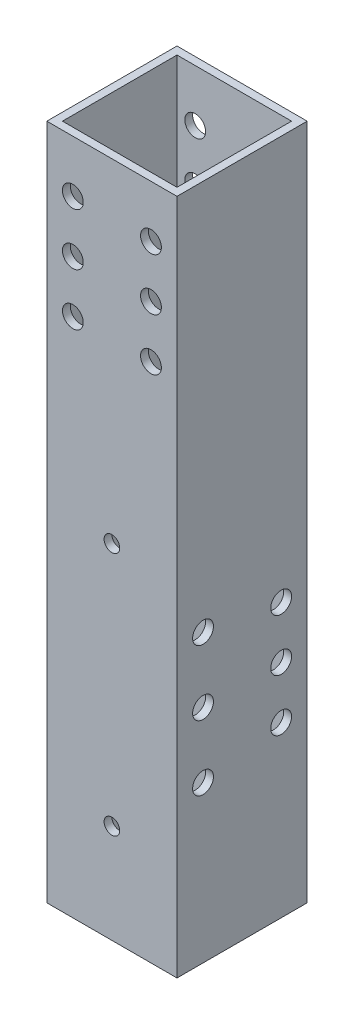
ISO-10303-21;
HEADER;
FILE_DESCRIPTION(('STEP AP214'),'2;1');
FILE_NAME('part.step','',(''),(''),'','','');
FILE_SCHEMA(('AUTOMOTIVE_DESIGN { 1 0 10303 214 1 1 1 1 }'));
ENDSEC;
DATA;
#1=APPLICATION_CONTEXT('core data for automotive mechanical design processes');
#2=APPLICATION_PROTOCOL_DEFINITION('international standard','automotive_design',2000,#1);
#3=PRODUCT_CONTEXT('',#1,'mechanical');
#4=PRODUCT('Part','Part','',(#3));
#5=PRODUCT_RELATED_PRODUCT_CATEGORY('part','',(#4));
#6=PRODUCT_DEFINITION_FORMATION('','',#4);
#7=PRODUCT_DEFINITION_CONTEXT('part definition',#1,'design');
#8=PRODUCT_DEFINITION('design','',#6,#7);
#9=PRODUCT_DEFINITION_SHAPE('','',#8);
#10=(LENGTH_UNIT() NAMED_UNIT(*) SI_UNIT(.MILLI.,.METRE.));
#11=(NAMED_UNIT(*) PLANE_ANGLE_UNIT() SI_UNIT($,.RADIAN.));
#12=(NAMED_UNIT(*) SI_UNIT($,.STERADIAN.) SOLID_ANGLE_UNIT());
#13=UNCERTAINTY_MEASURE_WITH_UNIT(LENGTH_MEASURE(1.E-05),#10,'distance_accuracy_value','');
#14=(GEOMETRIC_REPRESENTATION_CONTEXT(3) GLOBAL_UNCERTAINTY_ASSIGNED_CONTEXT((#13)) GLOBAL_UNIT_ASSIGNED_CONTEXT((#10,
#11,#12)) REPRESENTATION_CONTEXT('',''));
#15=CARTESIAN_POINT('',(0.,0.,0.));
#16=DIRECTION('',(0.,0.,1.));
#17=DIRECTION('',(1.,0.,0.));
#18=AXIS2_PLACEMENT_3D('',#15,#16,#17);
#19=CARTESIAN_POINT('',(12.5,-65.,-12.5));
#20=DIRECTION('',(1.,0.,0.));
#21=DIRECTION('',(0.,0.,-1.));
#22=AXIS2_PLACEMENT_3D('',#19,#20,#21);
#23=PLANE('',#22);
#24=CARTESIAN_POINT('',(12.5,-12.5,-7.5));
#25=DIRECTION('',(1.,0.,0.));
#26=DIRECTION('',(0.,0.,-1.));
#27=AXIS2_PLACEMENT_3D('',#24,#25,#26);
#28=CIRCLE('',#27,1.99999999999999);
#29=CARTESIAN_POINT('',(12.5,-12.5,-9.49999999999999));
#30=VERTEX_POINT('',#29);
#31=EDGE_CURVE('E244',#30,#30,#28,.T.);
#32=ORIENTED_EDGE('',*,*,#31,.F.);
#33=EDGE_LOOP('',(#32));
#34=FACE_BOUND('',#33,.T.);
#35=CARTESIAN_POINT('',(12.5,-22.5,-7.5));
#36=DIRECTION('',(1.,0.,0.));
#37=DIRECTION('',(0.,0.,-1.));
#38=AXIS2_PLACEMENT_3D('',#35,#36,#37);
#39=CIRCLE('',#38,2.);
#40=CARTESIAN_POINT('',(12.5,-22.5,-9.5));
#41=VERTEX_POINT('',#40);
#42=EDGE_CURVE('E250',#41,#41,#39,.T.);
#43=ORIENTED_EDGE('',*,*,#42,.F.);
#44=EDGE_LOOP('',(#43));
#45=FACE_BOUND('',#44,.T.);
#46=CARTESIAN_POINT('',(12.5,-35.,7.5));
#47=DIRECTION('',(1.,0.,0.));
#48=DIRECTION('',(0.,0.,-1.));
#49=AXIS2_PLACEMENT_3D('',#46,#47,#48);
#50=CIRCLE('',#49,2.);
#51=CARTESIAN_POINT('',(12.5,-35.,5.49999999999999));
#52=VERTEX_POINT('',#51);
#53=EDGE_CURVE('E256',#52,#52,#50,.T.);
#54=ORIENTED_EDGE('',*,*,#53,.F.);
#55=EDGE_LOOP('',(#54));
#56=FACE_BOUND('',#55,.T.);
#57=CARTESIAN_POINT('',(12.5,-10.,7.5));
#58=DIRECTION('',(1.,0.,0.));
#59=DIRECTION('',(0.,0.,-1.));
#60=AXIS2_PLACEMENT_3D('',#57,#58,#59);
#61=CIRCLE('',#60,2.);
#62=CARTESIAN_POINT('',(12.5,-10.,5.49999999999999));
#63=VERTEX_POINT('',#62);
#64=EDGE_CURVE('E237',#63,#63,#61,.T.);
#65=ORIENTED_EDGE('',*,*,#64,.F.);
#66=EDGE_LOOP('',(#65));
#67=FACE_BOUND('',#66,.T.);
#68=CARTESIAN_POINT('',(12.5,-22.5,7.5));
#69=DIRECTION('',(1.,0.,0.));
#70=DIRECTION('',(0.,0.,-1.));
#71=AXIS2_PLACEMENT_3D('',#68,#69,#70);
#72=CIRCLE('',#71,2.);
#73=CARTESIAN_POINT('',(12.5,-22.5,5.5));
#74=VERTEX_POINT('',#73);
#75=EDGE_CURVE('E233',#74,#74,#72,.T.);
#76=ORIENTED_EDGE('',*,*,#75,.F.);
#77=EDGE_LOOP('',(#76));
#78=FACE_BOUND('',#77,.T.);
#79=CARTESIAN_POINT('',(12.5,-32.5,-7.5));
#80=DIRECTION('',(1.,0.,0.));
#81=DIRECTION('',(0.,0.,-1.));
#82=AXIS2_PLACEMENT_3D('',#79,#80,#81);
#83=CIRCLE('',#82,2.);
#84=CARTESIAN_POINT('',(12.5,-32.5,-9.5));
#85=VERTEX_POINT('',#84);
#86=EDGE_CURVE('E243',#85,#85,#83,.T.);
#87=ORIENTED_EDGE('',*,*,#86,.F.);
#88=EDGE_LOOP('',(#87));
#89=FACE_BOUND('',#88,.T.);
#90=DIRECTION('',(0.,1.,0.));
#91=VECTOR('',#90,1.);
#92=CARTESIAN_POINT('',(12.5,-65.,-12.5));
#93=LINE('',#92,#91);
#94=CARTESIAN_POINT('',(12.5,-65.,-12.5));
#95=VERTEX_POINT('',#94);
#96=CARTESIAN_POINT('',(12.5,65.,-12.5));
#97=VERTEX_POINT('',#96);
#98=EDGE_CURVE('E161',#95,#97,#93,.T.);
#99=ORIENTED_EDGE('',*,*,#98,.T.);
#100=DIRECTION('',(0.,0.,-1.));
#101=VECTOR('',#100,1.);
#102=CARTESIAN_POINT('',(12.5,65.,-12.5));
#103=LINE('',#102,#101);
#104=CARTESIAN_POINT('',(12.5,65.,12.5));
#105=VERTEX_POINT('',#104);
#106=EDGE_CURVE('E129',#105,#97,#103,.T.);
#107=ORIENTED_EDGE('',*,*,#106,.F.);
#108=DIRECTION('',(0.,1.,0.));
#109=VECTOR('',#108,1.);
#110=CARTESIAN_POINT('',(12.5,-65.,12.5));
#111=LINE('',#110,#109);
#112=CARTESIAN_POINT('',(12.5,-65.,12.5));
#113=VERTEX_POINT('',#112);
#114=EDGE_CURVE('E11',#113,#105,#111,.T.);
#115=ORIENTED_EDGE('',*,*,#114,.F.);
#116=DIRECTION('',(0.,0.,-1.));
#117=VECTOR('',#116,1.);
#118=CARTESIAN_POINT('',(12.5,-65.,-12.5));
#119=LINE('',#118,#117);
#120=EDGE_CURVE('E148',#113,#95,#119,.T.);
#121=ORIENTED_EDGE('',*,*,#120,.T.);
#122=EDGE_LOOP('',(#99,#107,#115,#121));
#123=FACE_BOUND('',#122,.T.);
#124=ADVANCED_FACE('F32',(#34,#45,#56,#67,#78,#89,#123),#23,.T.);
#125=CARTESIAN_POINT('',(-12.5,-65.,12.5));
#126=DIRECTION('',(0.,0.,1.));
#127=DIRECTION('',(1.,0.,0.));
#128=AXIS2_PLACEMENT_3D('',#125,#126,#127);
#129=PLANE('',#128);
#130=CARTESIAN_POINT('',(7.5,45.,12.5));
#131=DIRECTION('',(0.,0.,-1.));
#132=DIRECTION('',(-1.,0.,0.));
#133=AXIS2_PLACEMENT_3D('',#130,#131,#132);
#134=CIRCLE('',#133,2.);
#135=CARTESIAN_POINT('',(5.5,45.,12.5));
#136=VERTEX_POINT('',#135);
#137=EDGE_CURVE('E676',#136,#136,#134,.T.);
#138=ORIENTED_EDGE('',*,*,#137,.T.);
#139=EDGE_LOOP('',(#138));
#140=FACE_BOUND('',#139,.T.);
#141=CARTESIAN_POINT('',(7.5,55.,12.5));
#142=DIRECTION('',(0.,0.,-1.));
#143=DIRECTION('',(-1.,0.,0.));
#144=AXIS2_PLACEMENT_3D('',#141,#142,#143);
#145=CIRCLE('',#144,2.);
#146=CARTESIAN_POINT('',(5.5,55.,12.5));
#147=VERTEX_POINT('',#146);
#148=EDGE_CURVE('E702',#147,#147,#145,.T.);
#149=ORIENTED_EDGE('',*,*,#148,.T.);
#150=EDGE_LOOP('',(#149));
#151=FACE_BOUND('',#150,.T.);
#152=CARTESIAN_POINT('',(7.5,35.,12.5));
#153=DIRECTION('',(0.,0.,-1.));
#154=DIRECTION('',(-1.,0.,0.));
#155=AXIS2_PLACEMENT_3D('',#152,#153,#154);
#156=CIRCLE('',#155,2.);
#157=CARTESIAN_POINT('',(5.5,35.,12.5));
#158=VERTEX_POINT('',#157);
#159=EDGE_CURVE('E701',#158,#158,#156,.T.);
#160=ORIENTED_EDGE('',*,*,#159,.T.);
#161=EDGE_LOOP('',(#160));
#162=FACE_BOUND('',#161,.T.);
#163=CARTESIAN_POINT('',(-7.5,45.,12.5));
#164=DIRECTION('',(0.,0.,-1.));
#165=DIRECTION('',(-1.,0.,0.));
#166=AXIS2_PLACEMENT_3D('',#163,#164,#165);
#167=CIRCLE('',#166,2.);
#168=CARTESIAN_POINT('',(-9.5,45.,12.5));
#169=VERTEX_POINT('',#168);
#170=EDGE_CURVE('E695',#169,#169,#167,.T.);
#171=ORIENTED_EDGE('',*,*,#170,.T.);
#172=EDGE_LOOP('',(#171));
#173=FACE_BOUND('',#172,.T.);
#174=CARTESIAN_POINT('',(-7.5,35.,12.5));
#175=DIRECTION('',(0.,0.,-1.));
#176=DIRECTION('',(-1.,0.,0.));
#177=AXIS2_PLACEMENT_3D('',#174,#175,#176);
#178=CIRCLE('',#177,2.);
#179=CARTESIAN_POINT('',(-9.5,35.,12.5));
#180=VERTEX_POINT('',#179);
#181=EDGE_CURVE('E713',#180,#180,#178,.T.);
#182=ORIENTED_EDGE('',*,*,#181,.T.);
#183=EDGE_LOOP('',(#182));
#184=FACE_BOUND('',#183,.T.);
#185=CARTESIAN_POINT('',(-7.5,55.,12.5));
#186=DIRECTION('',(0.,0.,-1.));
#187=DIRECTION('',(-1.,0.,0.));
#188=AXIS2_PLACEMENT_3D('',#185,#186,#187);
#189=CIRCLE('',#188,2.);
#190=CARTESIAN_POINT('',(-9.5,55.,12.5));
#191=VERTEX_POINT('',#190);
#192=EDGE_CURVE('E204',#191,#191,#189,.T.);
#193=ORIENTED_EDGE('',*,*,#192,.T.);
#194=EDGE_LOOP('',(#193));
#195=FACE_BOUND('',#194,.T.);
#196=CARTESIAN_POINT('',(0.,-46.,12.5));
#197=DIRECTION('',(0.,0.,-1.));
#198=DIRECTION('',(-1.,0.,0.));
#199=AXIS2_PLACEMENT_3D('',#196,#197,#198);
#200=CIRCLE('',#199,1.5);
#201=CARTESIAN_POINT('',(-1.5,-46.,12.5));
#202=VERTEX_POINT('',#201);
#203=EDGE_CURVE('E171',#202,#202,#200,.T.);
#204=ORIENTED_EDGE('',*,*,#203,.T.);
#205=EDGE_LOOP('',(#204));
#206=FACE_BOUND('',#205,.T.);
#207=CARTESIAN_POINT('',(0.,0.999999999999997,12.5));
#208=DIRECTION('',(0.,0.,-1.));
#209=DIRECTION('',(-1.,0.,0.));
#210=AXIS2_PLACEMENT_3D('',#207,#208,#209);
#211=CIRCLE('',#210,1.5);
#212=CARTESIAN_POINT('',(-1.5,0.999999999999997,12.5));
#213=VERTEX_POINT('',#212);
#214=EDGE_CURVE('E286',#213,#213,#211,.T.);
#215=ORIENTED_EDGE('',*,*,#214,.T.);
#216=EDGE_LOOP('',(#215));
#217=FACE_BOUND('',#216,.T.);
#218=ORIENTED_EDGE('',*,*,#114,.T.);
#219=DIRECTION('',(1.,0.,0.));
#220=VECTOR('',#219,1.);
#221=CARTESIAN_POINT('',(-12.5,65.,12.5));
#222=LINE('',#221,#220);
#223=CARTESIAN_POINT('',(-12.5,65.,12.5));
#224=VERTEX_POINT('',#223);
#225=EDGE_CURVE('E138',#224,#105,#222,.T.);
#226=ORIENTED_EDGE('',*,*,#225,.F.);
#227=DIRECTION('',(0.,1.,0.));
#228=VECTOR('',#227,1.);
#229=CARTESIAN_POINT('',(-12.5,-65.,12.5));
#230=LINE('',#229,#228);
#231=CARTESIAN_POINT('',(-12.5,-65.,12.5));
#232=VERTEX_POINT('',#231);
#233=EDGE_CURVE('E40',#232,#224,#230,.T.);
#234=ORIENTED_EDGE('',*,*,#233,.F.);
#235=DIRECTION('',(1.,0.,0.));
#236=VECTOR('',#235,1.);
#237=CARTESIAN_POINT('',(-12.5,-65.,12.5));
#238=LINE('',#237,#236);
#239=EDGE_CURVE('E159',#232,#113,#238,.T.);
#240=ORIENTED_EDGE('',*,*,#239,.T.);
#241=EDGE_LOOP('',(#218,#226,#234,#240));
#242=FACE_BOUND('',#241,.T.);
#243=ADVANCED_FACE('F320',(#140,#151,#162,#173,#184,#195,#206,#217,#242),#129,.T.);
#244=CARTESIAN_POINT('',(-12.5,-65.,-12.5));
#245=DIRECTION('',(-1.,0.,0.));
#246=DIRECTION('',(0.,0.,1.));
#247=AXIS2_PLACEMENT_3D('',#244,#245,#246);
#248=PLANE('',#247);
#249=CARTESIAN_POINT('',(-12.5,-12.5,-7.5));
#250=DIRECTION('',(1.,0.,0.));
#251=DIRECTION('',(0.,0.,-1.));
#252=AXIS2_PLACEMENT_3D('',#249,#250,#251);
#253=CIRCLE('',#252,1.99999999999999);
#254=CARTESIAN_POINT('',(-12.5,-12.5,-9.49999999999999));
#255=VERTEX_POINT('',#254);
#256=EDGE_CURVE('E240',#255,#255,#253,.T.);
#257=ORIENTED_EDGE('',*,*,#256,.T.);
#258=EDGE_LOOP('',(#257));
#259=FACE_BOUND('',#258,.T.);
#260=CARTESIAN_POINT('',(-12.5,-22.5,-7.5));
#261=DIRECTION('',(1.,0.,0.));
#262=DIRECTION('',(0.,0.,-1.));
#263=AXIS2_PLACEMENT_3D('',#260,#261,#262);
#264=CIRCLE('',#263,2.);
#265=CARTESIAN_POINT('',(-12.5,-22.5,-9.5));
#266=VERTEX_POINT('',#265);
#267=EDGE_CURVE('E247',#266,#266,#264,.T.);
#268=ORIENTED_EDGE('',*,*,#267,.T.);
#269=EDGE_LOOP('',(#268));
#270=FACE_BOUND('',#269,.T.);
#271=CARTESIAN_POINT('',(-12.5,-35.,7.5));
#272=DIRECTION('',(1.,0.,0.));
#273=DIRECTION('',(0.,0.,-1.));
#274=AXIS2_PLACEMENT_3D('',#271,#272,#273);
#275=CIRCLE('',#274,2.);
#276=CARTESIAN_POINT('',(-12.5,-35.,5.49999999999999));
#277=VERTEX_POINT('',#276);
#278=EDGE_CURVE('E253',#277,#277,#275,.T.);
#279=ORIENTED_EDGE('',*,*,#278,.T.);
#280=EDGE_LOOP('',(#279));
#281=FACE_BOUND('',#280,.T.);
#282=CARTESIAN_POINT('',(-12.5,-10.,7.5));
#283=DIRECTION('',(1.,0.,0.));
#284=DIRECTION('',(0.,0.,-1.));
#285=AXIS2_PLACEMENT_3D('',#282,#283,#284);
#286=CIRCLE('',#285,2.);
#287=CARTESIAN_POINT('',(-12.5,-10.,5.49999999999999));
#288=VERTEX_POINT('',#287);
#289=EDGE_CURVE('E259',#288,#288,#286,.T.);
#290=ORIENTED_EDGE('',*,*,#289,.T.);
#291=EDGE_LOOP('',(#290));
#292=FACE_BOUND('',#291,.T.);
#293=CARTESIAN_POINT('',(-12.5,-22.5,7.5));
#294=DIRECTION('',(1.,0.,0.));
#295=DIRECTION('',(0.,0.,-1.));
#296=AXIS2_PLACEMENT_3D('',#293,#294,#295);
#297=CIRCLE('',#296,2.);
#298=CARTESIAN_POINT('',(-12.5,-22.5,5.5));
#299=VERTEX_POINT('',#298);
#300=EDGE_CURVE('E234',#299,#299,#297,.T.);
#301=ORIENTED_EDGE('',*,*,#300,.T.);
#302=EDGE_LOOP('',(#301));
#303=FACE_BOUND('',#302,.T.);
#304=CARTESIAN_POINT('',(-12.5,-32.5,-7.5));
#305=DIRECTION('',(1.,0.,0.));
#306=DIRECTION('',(0.,0.,-1.));
#307=AXIS2_PLACEMENT_3D('',#304,#305,#306);
#308=CIRCLE('',#307,2.);
#309=CARTESIAN_POINT('',(-12.5,-32.5,-9.5));
#310=VERTEX_POINT('',#309);
#311=EDGE_CURVE('E179',#310,#310,#308,.T.);
#312=ORIENTED_EDGE('',*,*,#311,.T.);
#313=EDGE_LOOP('',(#312));
#314=FACE_BOUND('',#313,.T.);
#315=ORIENTED_EDGE('',*,*,#233,.T.);
#316=DIRECTION('',(0.,0.,1.));
#317=VECTOR('',#316,1.);
#318=CARTESIAN_POINT('',(-12.5,65.,-12.5));
#319=LINE('',#318,#317);
#320=CARTESIAN_POINT('',(-12.5,65.,-12.5));
#321=VERTEX_POINT('',#320);
#322=EDGE_CURVE('E135',#321,#224,#319,.T.);
#323=ORIENTED_EDGE('',*,*,#322,.F.);
#324=DIRECTION('',(0.,1.,0.));
#325=VECTOR('',#324,1.);
#326=CARTESIAN_POINT('',(-12.5,-65.,-12.5));
#327=LINE('',#326,#325);
#328=CARTESIAN_POINT('',(-12.5,-65.,-12.5));
#329=VERTEX_POINT('',#328);
#330=EDGE_CURVE('E164',#329,#321,#327,.T.);
#331=ORIENTED_EDGE('',*,*,#330,.F.);
#332=DIRECTION('',(0.,0.,1.));
#333=VECTOR('',#332,1.);
#334=CARTESIAN_POINT('',(-12.5,-65.,-12.5));
#335=LINE('',#334,#333);
#336=EDGE_CURVE('E156',#329,#232,#335,.T.);
#337=ORIENTED_EDGE('',*,*,#336,.T.);
#338=EDGE_LOOP('',(#315,#323,#331,#337));
#339=FACE_BOUND('',#338,.T.);
#340=ADVANCED_FACE('F325',(#259,#270,#281,#292,#303,#314,#339),#248,.T.);
#341=CARTESIAN_POINT('',(-12.5,-65.,-12.5));
#342=DIRECTION('',(0.,0.,-1.));
#343=DIRECTION('',(-1.,0.,0.));
#344=AXIS2_PLACEMENT_3D('',#341,#342,#343);
#345=PLANE('',#344);
#346=CARTESIAN_POINT('',(7.5,45.,-12.5));
#347=DIRECTION('',(0.,0.,-1.));
#348=DIRECTION('',(-1.,0.,0.));
#349=AXIS2_PLACEMENT_3D('',#346,#347,#348);
#350=CIRCLE('',#349,2.);
#351=CARTESIAN_POINT('',(5.5,45.,-12.5));
#352=VERTEX_POINT('',#351);
#353=EDGE_CURVE('E710',#352,#352,#350,.T.);
#354=ORIENTED_EDGE('',*,*,#353,.F.);
#355=EDGE_LOOP('',(#354));
#356=FACE_BOUND('',#355,.T.);
#357=CARTESIAN_POINT('',(7.5,55.,-12.5));
#358=DIRECTION('',(0.,0.,-1.));
#359=DIRECTION('',(-1.,0.,0.));
#360=AXIS2_PLACEMENT_3D('',#357,#358,#359);
#361=CIRCLE('',#360,2.);
#362=CARTESIAN_POINT('',(5.5,55.,-12.5));
#363=VERTEX_POINT('',#362);
#364=EDGE_CURVE('E715',#363,#363,#361,.T.);
#365=ORIENTED_EDGE('',*,*,#364,.F.);
#366=EDGE_LOOP('',(#365));
#367=FACE_BOUND('',#366,.T.);
#368=CARTESIAN_POINT('',(7.5,35.,-12.5));
#369=DIRECTION('',(0.,0.,-1.));
#370=DIRECTION('',(-1.,0.,0.));
#371=AXIS2_PLACEMENT_3D('',#368,#369,#370);
#372=CIRCLE('',#371,2.);
#373=CARTESIAN_POINT('',(5.5,35.,-12.5));
#374=VERTEX_POINT('',#373);
#375=EDGE_CURVE('E698',#374,#374,#372,.T.);
#376=ORIENTED_EDGE('',*,*,#375,.F.);
#377=EDGE_LOOP('',(#376));
#378=FACE_BOUND('',#377,.T.);
#379=CARTESIAN_POINT('',(-7.5,45.,-12.5));
#380=DIRECTION('',(0.,0.,-1.));
#381=DIRECTION('',(-1.,0.,0.));
#382=AXIS2_PLACEMENT_3D('',#379,#380,#381);
#383=CIRCLE('',#382,2.);
#384=CARTESIAN_POINT('',(-9.5,45.,-12.5));
#385=VERTEX_POINT('',#384);
#386=EDGE_CURVE('E705',#385,#385,#383,.T.);
#387=ORIENTED_EDGE('',*,*,#386,.F.);
#388=EDGE_LOOP('',(#387));
#389=FACE_BOUND('',#388,.T.);
#390=CARTESIAN_POINT('',(-7.5,35.,-12.5));
#391=DIRECTION('',(0.,0.,-1.));
#392=DIRECTION('',(-1.,0.,0.));
#393=AXIS2_PLACEMENT_3D('',#390,#391,#392);
#394=CIRCLE('',#393,2.);
#395=CARTESIAN_POINT('',(-9.5,35.,-12.5));
#396=VERTEX_POINT('',#395);
#397=EDGE_CURVE('E720',#396,#396,#394,.T.);
#398=ORIENTED_EDGE('',*,*,#397,.F.);
#399=EDGE_LOOP('',(#398));
#400=FACE_BOUND('',#399,.T.);
#401=CARTESIAN_POINT('',(-7.5,55.,-12.5));
#402=DIRECTION('',(0.,0.,-1.));
#403=DIRECTION('',(-1.,0.,0.));
#404=AXIS2_PLACEMENT_3D('',#401,#402,#403);
#405=CIRCLE('',#404,2.);
#406=CARTESIAN_POINT('',(-9.5,55.,-12.5));
#407=VERTEX_POINT('',#406);
#408=EDGE_CURVE('E692',#407,#407,#405,.T.);
#409=ORIENTED_EDGE('',*,*,#408,.F.);
#410=EDGE_LOOP('',(#409));
#411=FACE_BOUND('',#410,.T.);
#412=CARTESIAN_POINT('',(0.,-46.,-12.5));
#413=DIRECTION('',(0.,0.,-1.));
#414=DIRECTION('',(-1.,0.,0.));
#415=AXIS2_PLACEMENT_3D('',#412,#413,#414);
#416=CIRCLE('',#415,1.5);
#417=CARTESIAN_POINT('',(-1.5,-46.,-12.5));
#418=VERTEX_POINT('',#417);
#419=EDGE_CURVE('E283',#418,#418,#416,.T.);
#420=ORIENTED_EDGE('',*,*,#419,.F.);
#421=EDGE_LOOP('',(#420));
#422=FACE_BOUND('',#421,.T.);
#423=CARTESIAN_POINT('',(0.,0.999999999999997,-12.5));
#424=DIRECTION('',(0.,0.,-1.));
#425=DIRECTION('',(-1.,0.,0.));
#426=AXIS2_PLACEMENT_3D('',#423,#424,#425);
#427=CIRCLE('',#426,1.5);
#428=CARTESIAN_POINT('',(-1.5,0.999999999999997,-12.5));
#429=VERTEX_POINT('',#428);
#430=EDGE_CURVE('E280',#429,#429,#427,.T.);
#431=ORIENTED_EDGE('',*,*,#430,.F.);
#432=EDGE_LOOP('',(#431));
#433=FACE_BOUND('',#432,.T.);
#434=ORIENTED_EDGE('',*,*,#330,.T.);
#435=DIRECTION('',(-1.,0.,0.));
#436=VECTOR('',#435,1.);
#437=CARTESIAN_POINT('',(-12.5,65.,-12.5));
#438=LINE('',#437,#436);
#439=EDGE_CURVE('E132',#97,#321,#438,.T.);
#440=ORIENTED_EDGE('',*,*,#439,.F.);
#441=ORIENTED_EDGE('',*,*,#98,.F.);
#442=DIRECTION('',(-1.,0.,0.));
#443=VECTOR('',#442,1.);
#444=CARTESIAN_POINT('',(-12.5,-65.,-12.5));
#445=LINE('',#444,#443);
#446=EDGE_CURVE('E153',#95,#329,#445,.T.);
#447=ORIENTED_EDGE('',*,*,#446,.T.);
#448=EDGE_LOOP('',(#434,#440,#441,#447));
#449=FACE_BOUND('',#448,.T.);
#450=ADVANCED_FACE('F342',(#356,#367,#378,#389,#400,#411,#422,#433,#449),#345,.T.);
#451=CARTESIAN_POINT('',(0.,-65.,0.));
#452=DIRECTION('',(0.,1.,0.));
#453=DIRECTION('',(0.,0.,1.));
#454=AXIS2_PLACEMENT_3D('',#451,#452,#453);
#455=PLANE('',#454);
#456=DIRECTION('',(1.,0.,0.));
#457=VECTOR('',#456,1.);
#458=CARTESIAN_POINT('',(-11.,-65.,11.));
#459=LINE('',#458,#457);
#460=CARTESIAN_POINT('',(-11.,-65.,11.));
#461=VERTEX_POINT('',#460);
#462=CARTESIAN_POINT('',(11.,-65.,11.));
#463=VERTEX_POINT('',#462);
#464=EDGE_CURVE('E109',#461,#463,#459,.T.);
#465=ORIENTED_EDGE('',*,*,#464,.T.);
#466=DIRECTION('',(0.,0.,-1.));
#467=VECTOR('',#466,1.);
#468=CARTESIAN_POINT('',(11.,-65.,-11.));
#469=LINE('',#468,#467);
#470=CARTESIAN_POINT('',(11.,-65.,-11.));
#471=VERTEX_POINT('',#470);
#472=EDGE_CURVE('E141',#463,#471,#469,.T.);
#473=ORIENTED_EDGE('',*,*,#472,.T.);
#474=DIRECTION('',(-1.,0.,0.));
#475=VECTOR('',#474,1.);
#476=CARTESIAN_POINT('',(-11.,-65.,-11.));
#477=LINE('',#476,#475);
#478=CARTESIAN_POINT('',(-11.,-65.,-11.));
#479=VERTEX_POINT('',#478);
#480=EDGE_CURVE('E104',#471,#479,#477,.T.);
#481=ORIENTED_EDGE('',*,*,#480,.T.);
#482=DIRECTION('',(0.,0.,1.));
#483=VECTOR('',#482,1.);
#484=CARTESIAN_POINT('',(-11.,-65.,-11.));
#485=LINE('',#484,#483);
#486=EDGE_CURVE('E48',#479,#461,#485,.T.);
#487=ORIENTED_EDGE('',*,*,#486,.T.);
#488=EDGE_LOOP('',(#465,#473,#481,#487));
#489=FACE_BOUND('',#488,.T.);
#490=ORIENTED_EDGE('',*,*,#120,.F.);
#491=ORIENTED_EDGE('',*,*,#239,.F.);
#492=ORIENTED_EDGE('',*,*,#336,.F.);
#493=ORIENTED_EDGE('',*,*,#446,.F.);
#494=EDGE_LOOP('',(#490,#491,#492,#493));
#495=FACE_BOUND('',#494,.T.);
#496=ADVANCED_FACE('F350',(#489,#495),#455,.F.);
#497=CARTESIAN_POINT('',(11.,-65.,-11.));
#498=DIRECTION('',(1.,0.,0.));
#499=DIRECTION('',(0.,0.,-1.));
#500=AXIS2_PLACEMENT_3D('',#497,#498,#499);
#501=PLANE('',#500);
#502=CARTESIAN_POINT('',(11.,-12.5,-7.5));
#503=DIRECTION('',(1.,0.,0.));
#504=DIRECTION('',(0.,0.,-1.));
#505=AXIS2_PLACEMENT_3D('',#502,#503,#504);
#506=CIRCLE('',#505,1.99999999999999);
#507=CARTESIAN_POINT('',(11.,-12.5,-9.49999999999999));
#508=VERTEX_POINT('',#507);
#509=EDGE_CURVE('E199',#508,#508,#506,.T.);
#510=ORIENTED_EDGE('',*,*,#509,.T.);
#511=EDGE_LOOP('',(#510));
#512=FACE_BOUND('',#511,.T.);
#513=CARTESIAN_POINT('',(11.,-22.5,-7.5));
#514=DIRECTION('',(1.,0.,0.));
#515=DIRECTION('',(0.,0.,-1.));
#516=AXIS2_PLACEMENT_3D('',#513,#514,#515);
#517=CIRCLE('',#516,2.);
#518=CARTESIAN_POINT('',(11.,-22.5,-9.5));
#519=VERTEX_POINT('',#518);
#520=EDGE_CURVE('E195',#519,#519,#517,.T.);
#521=ORIENTED_EDGE('',*,*,#520,.T.);
#522=EDGE_LOOP('',(#521));
#523=FACE_BOUND('',#522,.T.);
#524=CARTESIAN_POINT('',(11.,-35.,7.5));
#525=DIRECTION('',(1.,0.,0.));
#526=DIRECTION('',(0.,0.,-1.));
#527=AXIS2_PLACEMENT_3D('',#524,#525,#526);
#528=CIRCLE('',#527,2.);
#529=CARTESIAN_POINT('',(11.,-35.,5.49999999999999));
#530=VERTEX_POINT('',#529);
#531=EDGE_CURVE('E191',#530,#530,#528,.T.);
#532=ORIENTED_EDGE('',*,*,#531,.T.);
#533=EDGE_LOOP('',(#532));
#534=FACE_BOUND('',#533,.T.);
#535=CARTESIAN_POINT('',(11.,-10.,7.5));
#536=DIRECTION('',(1.,0.,0.));
#537=DIRECTION('',(0.,0.,-1.));
#538=AXIS2_PLACEMENT_3D('',#535,#536,#537);
#539=CIRCLE('',#538,2.);
#540=CARTESIAN_POINT('',(11.,-10.,5.49999999999999));
#541=VERTEX_POINT('',#540);
#542=EDGE_CURVE('E187',#541,#541,#539,.T.);
#543=ORIENTED_EDGE('',*,*,#542,.T.);
#544=EDGE_LOOP('',(#543));
#545=FACE_BOUND('',#544,.T.);
#546=CARTESIAN_POINT('',(11.,-22.5,7.5));
#547=DIRECTION('',(1.,0.,0.));
#548=DIRECTION('',(0.,0.,-1.));
#549=AXIS2_PLACEMENT_3D('',#546,#547,#548);
#550=CIRCLE('',#549,2.);
#551=CARTESIAN_POINT('',(11.,-22.5,5.5));
#552=VERTEX_POINT('',#551);
#553=EDGE_CURVE('E183',#552,#552,#550,.T.);
#554=ORIENTED_EDGE('',*,*,#553,.T.);
#555=EDGE_LOOP('',(#554));
#556=FACE_BOUND('',#555,.T.);
#557=CARTESIAN_POINT('',(11.,-32.5,-7.5));
#558=DIRECTION('',(1.,0.,0.));
#559=DIRECTION('',(0.,0.,-1.));
#560=AXIS2_PLACEMENT_3D('',#557,#558,#559);
#561=CIRCLE('',#560,2.);
#562=CARTESIAN_POINT('',(11.,-32.5,-9.5));
#563=VERTEX_POINT('',#562);
#564=EDGE_CURVE('E178',#563,#563,#561,.T.);
#565=ORIENTED_EDGE('',*,*,#564,.T.);
#566=EDGE_LOOP('',(#565));
#567=FACE_BOUND('',#566,.T.);
#568=DIRECTION('',(0.,1.,0.));
#569=VECTOR('',#568,1.);
#570=CARTESIAN_POINT('',(11.,-65.,11.));
#571=LINE('',#570,#569);
#572=CARTESIAN_POINT('',(11.,65.,11.));
#573=VERTEX_POINT('',#572);
#574=EDGE_CURVE('E114',#463,#573,#571,.T.);
#575=ORIENTED_EDGE('',*,*,#574,.T.);
#576=DIRECTION('',(0.,0.,-1.));
#577=VECTOR('',#576,1.);
#578=CARTESIAN_POINT('',(11.,65.,-11.));
#579=LINE('',#578,#577);
#580=CARTESIAN_POINT('',(11.,65.,-11.));
#581=VERTEX_POINT('',#580);
#582=EDGE_CURVE('E112',#573,#581,#579,.T.);
#583=ORIENTED_EDGE('',*,*,#582,.T.);
#584=DIRECTION('',(0.,1.,0.));
#585=VECTOR('',#584,1.);
#586=CARTESIAN_POINT('',(11.,-65.,-11.));
#587=LINE('',#586,#585);
#588=EDGE_CURVE('E97',#471,#581,#587,.T.);
#589=ORIENTED_EDGE('',*,*,#588,.F.);
#590=ORIENTED_EDGE('',*,*,#472,.F.);
#591=EDGE_LOOP('',(#575,#583,#589,#590));
#592=FACE_BOUND('',#591,.T.);
#593=ADVANCED_FACE('F113',(#512,#523,#534,#545,#556,#567,#592),#501,.F.);
#594=CARTESIAN_POINT('',(-11.,-65.,11.));
#595=DIRECTION('',(0.,0.,1.));
#596=DIRECTION('',(1.,0.,0.));
#597=AXIS2_PLACEMENT_3D('',#594,#595,#596);
#598=PLANE('',#597);
#599=CARTESIAN_POINT('',(7.5,45.,11.));
#600=DIRECTION('',(0.,0.,1.));
#601=DIRECTION('',(1.,0.,0.));
#602=AXIS2_PLACEMENT_3D('',#599,#600,#601);
#603=CIRCLE('',#602,2.);
#604=CARTESIAN_POINT('',(9.5,45.,11.));
#605=VERTEX_POINT('',#604);
#606=EDGE_CURVE('E230',#605,#605,#603,.T.);
#607=ORIENTED_EDGE('',*,*,#606,.T.);
#608=EDGE_LOOP('',(#607));
#609=FACE_BOUND('',#608,.T.);
#610=CARTESIAN_POINT('',(7.5,55.,11.));
#611=DIRECTION('',(0.,0.,1.));
#612=DIRECTION('',(1.,0.,0.));
#613=AXIS2_PLACEMENT_3D('',#610,#611,#612);
#614=CIRCLE('',#613,2.);
#615=CARTESIAN_POINT('',(9.5,55.,11.));
#616=VERTEX_POINT('',#615);
#617=EDGE_CURVE('E218',#616,#616,#614,.T.);
#618=ORIENTED_EDGE('',*,*,#617,.T.);
#619=EDGE_LOOP('',(#618));
#620=FACE_BOUND('',#619,.T.);
#621=CARTESIAN_POINT('',(7.5,35.,11.));
#622=DIRECTION('',(0.,0.,1.));
#623=DIRECTION('',(1.,0.,0.));
#624=AXIS2_PLACEMENT_3D('',#621,#622,#623);
#625=CIRCLE('',#624,2.);
#626=CARTESIAN_POINT('',(9.50000000000001,35.,11.));
#627=VERTEX_POINT('',#626);
#628=EDGE_CURVE('E215',#627,#627,#625,.T.);
#629=ORIENTED_EDGE('',*,*,#628,.T.);
#630=EDGE_LOOP('',(#629));
#631=FACE_BOUND('',#630,.T.);
#632=CARTESIAN_POINT('',(-7.5,45.,11.));
#633=DIRECTION('',(0.,0.,1.));
#634=DIRECTION('',(1.,0.,0.));
#635=AXIS2_PLACEMENT_3D('',#632,#633,#634);
#636=CIRCLE('',#635,2.);
#637=CARTESIAN_POINT('',(-5.5,45.,11.));
#638=VERTEX_POINT('',#637);
#639=EDGE_CURVE('E212',#638,#638,#636,.T.);
#640=ORIENTED_EDGE('',*,*,#639,.T.);
#641=EDGE_LOOP('',(#640));
#642=FACE_BOUND('',#641,.T.);
#643=CARTESIAN_POINT('',(-7.5,35.,11.));
#644=DIRECTION('',(0.,0.,1.));
#645=DIRECTION('',(1.,0.,0.));
#646=AXIS2_PLACEMENT_3D('',#643,#644,#645);
#647=CIRCLE('',#646,2.);
#648=CARTESIAN_POINT('',(-5.5,35.,11.));
#649=VERTEX_POINT('',#648);
#650=EDGE_CURVE('E208',#649,#649,#647,.T.);
#651=ORIENTED_EDGE('',*,*,#650,.T.);
#652=EDGE_LOOP('',(#651));
#653=FACE_BOUND('',#652,.T.);
#654=CARTESIAN_POINT('',(-7.5,55.,11.));
#655=DIRECTION('',(0.,0.,1.));
#656=DIRECTION('',(1.,0.,0.));
#657=AXIS2_PLACEMENT_3D('',#654,#655,#656);
#658=CIRCLE('',#657,2.);
#659=CARTESIAN_POINT('',(-5.5,55.,11.));
#660=VERTEX_POINT('',#659);
#661=EDGE_CURVE('E203',#660,#660,#658,.T.);
#662=ORIENTED_EDGE('',*,*,#661,.T.);
#663=EDGE_LOOP('',(#662));
#664=FACE_BOUND('',#663,.T.);
#665=CARTESIAN_POINT('',(0.,-46.,11.));
#666=DIRECTION('',(0.,0.,1.));
#667=DIRECTION('',(1.,0.,0.));
#668=AXIS2_PLACEMENT_3D('',#665,#666,#667);
#669=CIRCLE('',#668,1.5);
#670=CARTESIAN_POINT('',(1.5,-46.,11.));
#671=VERTEX_POINT('',#670);
#672=EDGE_CURVE('E118',#671,#671,#669,.T.);
#673=ORIENTED_EDGE('',*,*,#672,.T.);
#674=EDGE_LOOP('',(#673));
#675=FACE_BOUND('',#674,.T.);
#676=CARTESIAN_POINT('',(0.,0.999999999999997,11.));
#677=DIRECTION('',(0.,0.,1.));
#678=DIRECTION('',(1.,0.,0.));
#679=AXIS2_PLACEMENT_3D('',#676,#677,#678);
#680=CIRCLE('',#679,1.5);
#681=CARTESIAN_POINT('',(1.5,0.999999999999997,11.));
#682=VERTEX_POINT('',#681);
#683=EDGE_CURVE('E170',#682,#682,#680,.T.);
#684=ORIENTED_EDGE('',*,*,#683,.T.);
#685=EDGE_LOOP('',(#684));
#686=FACE_BOUND('',#685,.T.);
#687=DIRECTION('',(0.,1.,0.));
#688=VECTOR('',#687,1.);
#689=CARTESIAN_POINT('',(-11.,-65.,11.));
#690=LINE('',#689,#688);
#691=CARTESIAN_POINT('',(-11.,65.,11.));
#692=VERTEX_POINT('',#691);
#693=EDGE_CURVE('E149',#461,#692,#690,.T.);
#694=ORIENTED_EDGE('',*,*,#693,.T.);
#695=DIRECTION('',(1.,0.,0.));
#696=VECTOR('',#695,1.);
#697=CARTESIAN_POINT('',(-11.,65.,11.));
#698=LINE('',#697,#696);
#699=EDGE_CURVE('E124',#692,#573,#698,.T.);
#700=ORIENTED_EDGE('',*,*,#699,.T.);
#701=ORIENTED_EDGE('',*,*,#574,.F.);
#702=ORIENTED_EDGE('',*,*,#464,.F.);
#703=EDGE_LOOP('',(#694,#700,#701,#702));
#704=FACE_BOUND('',#703,.T.);
#705=ADVANCED_FACE('F295',(#609,#620,#631,#642,#653,#664,#675,#686,#704),#598,.F.);
#706=CARTESIAN_POINT('',(-11.,-65.,-11.));
#707=DIRECTION('',(-1.,0.,0.));
#708=DIRECTION('',(0.,0.,1.));
#709=AXIS2_PLACEMENT_3D('',#706,#707,#708);
#710=PLANE('',#709);
#711=CARTESIAN_POINT('',(-11.,-12.5,-7.5));
#712=DIRECTION('',(-1.,0.,0.));
#713=DIRECTION('',(0.,0.,1.));
#714=AXIS2_PLACEMENT_3D('',#711,#712,#713);
#715=CIRCLE('',#714,1.99999999999999);
#716=CARTESIAN_POINT('',(-11.,-12.5,-5.50000000000001));
#717=VERTEX_POINT('',#716);
#718=EDGE_CURVE('E196',#717,#717,#715,.T.);
#719=ORIENTED_EDGE('',*,*,#718,.T.);
#720=EDGE_LOOP('',(#719));
#721=FACE_BOUND('',#720,.T.);
#722=CARTESIAN_POINT('',(-11.,-22.5,-7.5));
#723=DIRECTION('',(-1.,0.,0.));
#724=DIRECTION('',(0.,0.,1.));
#725=AXIS2_PLACEMENT_3D('',#722,#723,#724);
#726=CIRCLE('',#725,2.);
#727=CARTESIAN_POINT('',(-11.,-22.5,-5.5));
#728=VERTEX_POINT('',#727);
#729=EDGE_CURVE('E192',#728,#728,#726,.T.);
#730=ORIENTED_EDGE('',*,*,#729,.T.);
#731=EDGE_LOOP('',(#730));
#732=FACE_BOUND('',#731,.T.);
#733=CARTESIAN_POINT('',(-11.,-35.,7.5));
#734=DIRECTION('',(-1.,0.,0.));
#735=DIRECTION('',(0.,0.,1.));
#736=AXIS2_PLACEMENT_3D('',#733,#734,#735);
#737=CIRCLE('',#736,2.);
#738=CARTESIAN_POINT('',(-11.,-35.,9.5));
#739=VERTEX_POINT('',#738);
#740=EDGE_CURVE('E188',#739,#739,#737,.T.);
#741=ORIENTED_EDGE('',*,*,#740,.T.);
#742=EDGE_LOOP('',(#741));
#743=FACE_BOUND('',#742,.T.);
#744=CARTESIAN_POINT('',(-11.,-10.,7.5));
#745=DIRECTION('',(-1.,0.,0.));
#746=DIRECTION('',(0.,0.,1.));
#747=AXIS2_PLACEMENT_3D('',#744,#745,#746);
#748=CIRCLE('',#747,2.);
#749=CARTESIAN_POINT('',(-11.,-10.,9.5));
#750=VERTEX_POINT('',#749);
#751=EDGE_CURVE('E184',#750,#750,#748,.T.);
#752=ORIENTED_EDGE('',*,*,#751,.T.);
#753=EDGE_LOOP('',(#752));
#754=FACE_BOUND('',#753,.T.);
#755=CARTESIAN_POINT('',(-11.,-22.5,7.5));
#756=DIRECTION('',(-1.,0.,0.));
#757=DIRECTION('',(0.,0.,1.));
#758=AXIS2_PLACEMENT_3D('',#755,#756,#757);
#759=CIRCLE('',#758,2.);
#760=CARTESIAN_POINT('',(-11.,-22.5,9.5));
#761=VERTEX_POINT('',#760);
#762=EDGE_CURVE('E180',#761,#761,#759,.T.);
#763=ORIENTED_EDGE('',*,*,#762,.T.);
#764=EDGE_LOOP('',(#763));
#765=FACE_BOUND('',#764,.T.);
#766=CARTESIAN_POINT('',(-11.,-32.5,-7.5));
#767=DIRECTION('',(-1.,0.,0.));
#768=DIRECTION('',(0.,0.,1.));
#769=AXIS2_PLACEMENT_3D('',#766,#767,#768);
#770=CIRCLE('',#769,2.);
#771=CARTESIAN_POINT('',(-11.,-32.5,-5.5));
#772=VERTEX_POINT('',#771);
#773=EDGE_CURVE('E175',#772,#772,#770,.T.);
#774=ORIENTED_EDGE('',*,*,#773,.T.);
#775=EDGE_LOOP('',(#774));
#776=FACE_BOUND('',#775,.T.);
#777=DIRECTION('',(0.,1.,0.));
#778=VECTOR('',#777,1.);
#779=CARTESIAN_POINT('',(-11.,-65.,-11.));
#780=LINE('',#779,#778);
#781=CARTESIAN_POINT('',(-11.,65.,-11.));
#782=VERTEX_POINT('',#781);
#783=EDGE_CURVE('E108',#479,#782,#780,.T.);
#784=ORIENTED_EDGE('',*,*,#783,.T.);
#785=DIRECTION('',(0.,0.,1.));
#786=VECTOR('',#785,1.);
#787=CARTESIAN_POINT('',(-11.,65.,-11.));
#788=LINE('',#787,#786);
#789=EDGE_CURVE('E122',#782,#692,#788,.T.);
#790=ORIENTED_EDGE('',*,*,#789,.T.);
#791=ORIENTED_EDGE('',*,*,#693,.F.);
#792=ORIENTED_EDGE('',*,*,#486,.F.);
#793=EDGE_LOOP('',(#784,#790,#791,#792));
#794=FACE_BOUND('',#793,.T.);
#795=ADVANCED_FACE('F369',(#721,#732,#743,#754,#765,#776,#794),#710,.F.);
#796=CARTESIAN_POINT('',(-11.,-65.,-11.));
#797=DIRECTION('',(0.,0.,-1.));
#798=DIRECTION('',(-1.,0.,0.));
#799=AXIS2_PLACEMENT_3D('',#796,#797,#798);
#800=PLANE('',#799);
#801=CARTESIAN_POINT('',(7.5,45.,-11.));
#802=DIRECTION('',(0.,0.,-1.));
#803=DIRECTION('',(-1.,0.,0.));
#804=AXIS2_PLACEMENT_3D('',#801,#802,#803);
#805=CIRCLE('',#804,2.);
#806=CARTESIAN_POINT('',(5.5,45.,-11.));
#807=VERTEX_POINT('',#806);
#808=EDGE_CURVE('E35',#807,#807,#805,.T.);
#809=ORIENTED_EDGE('',*,*,#808,.T.);
#810=EDGE_LOOP('',(#809));
#811=FACE_BOUND('',#810,.T.);
#812=CARTESIAN_POINT('',(7.5,55.,-11.));
#813=DIRECTION('',(0.,0.,-1.));
#814=DIRECTION('',(-1.,0.,0.));
#815=AXIS2_PLACEMENT_3D('',#812,#813,#814);
#816=CIRCLE('',#815,2.);
#817=CARTESIAN_POINT('',(5.5,55.,-11.));
#818=VERTEX_POINT('',#817);
#819=EDGE_CURVE('E216',#818,#818,#816,.T.);
#820=ORIENTED_EDGE('',*,*,#819,.T.);
#821=EDGE_LOOP('',(#820));
#822=FACE_BOUND('',#821,.T.);
#823=CARTESIAN_POINT('',(7.5,35.,-11.));
#824=DIRECTION('',(0.,0.,-1.));
#825=DIRECTION('',(-1.,0.,0.));
#826=AXIS2_PLACEMENT_3D('',#823,#824,#825);
#827=CIRCLE('',#826,2.);
#828=CARTESIAN_POINT('',(5.5,35.,-11.));
#829=VERTEX_POINT('',#828);
#830=EDGE_CURVE('E213',#829,#829,#827,.T.);
#831=ORIENTED_EDGE('',*,*,#830,.T.);
#832=EDGE_LOOP('',(#831));
#833=FACE_BOUND('',#832,.T.);
#834=CARTESIAN_POINT('',(-7.5,45.,-11.));
#835=DIRECTION('',(0.,0.,-1.));
#836=DIRECTION('',(-1.,0.,0.));
#837=AXIS2_PLACEMENT_3D('',#834,#835,#836);
#838=CIRCLE('',#837,2.);
#839=CARTESIAN_POINT('',(-9.5,45.,-11.));
#840=VERTEX_POINT('',#839);
#841=EDGE_CURVE('E209',#840,#840,#838,.T.);
#842=ORIENTED_EDGE('',*,*,#841,.T.);
#843=EDGE_LOOP('',(#842));
#844=FACE_BOUND('',#843,.T.);
#845=CARTESIAN_POINT('',(-7.5,35.,-11.));
#846=DIRECTION('',(0.,0.,-1.));
#847=DIRECTION('',(-1.,0.,0.));
#848=AXIS2_PLACEMENT_3D('',#845,#846,#847);
#849=CIRCLE('',#848,2.);
#850=CARTESIAN_POINT('',(-9.5,35.,-11.));
#851=VERTEX_POINT('',#850);
#852=EDGE_CURVE('E205',#851,#851,#849,.T.);
#853=ORIENTED_EDGE('',*,*,#852,.T.);
#854=EDGE_LOOP('',(#853));
#855=FACE_BOUND('',#854,.T.);
#856=CARTESIAN_POINT('',(-7.5,55.,-11.));
#857=DIRECTION('',(0.,0.,-1.));
#858=DIRECTION('',(-1.,0.,0.));
#859=AXIS2_PLACEMENT_3D('',#856,#857,#858);
#860=CIRCLE('',#859,2.);
#861=CARTESIAN_POINT('',(-9.5,55.,-11.));
#862=VERTEX_POINT('',#861);
#863=EDGE_CURVE('E200',#862,#862,#860,.T.);
#864=ORIENTED_EDGE('',*,*,#863,.T.);
#865=EDGE_LOOP('',(#864));
#866=FACE_BOUND('',#865,.T.);
#867=CARTESIAN_POINT('',(0.,-46.,-11.));
#868=DIRECTION('',(0.,0.,-1.));
#869=DIRECTION('',(-1.,0.,0.));
#870=AXIS2_PLACEMENT_3D('',#867,#868,#869);
#871=CIRCLE('',#870,1.5);
#872=CARTESIAN_POINT('',(-1.5,-46.,-11.));
#873=VERTEX_POINT('',#872);
#874=EDGE_CURVE('E172',#873,#873,#871,.T.);
#875=ORIENTED_EDGE('',*,*,#874,.T.);
#876=EDGE_LOOP('',(#875));
#877=FACE_BOUND('',#876,.T.);
#878=CARTESIAN_POINT('',(0.,0.999999999999997,-11.));
#879=DIRECTION('',(0.,0.,-1.));
#880=DIRECTION('',(-1.,0.,0.));
#881=AXIS2_PLACEMENT_3D('',#878,#879,#880);
#882=CIRCLE('',#881,1.5);
#883=CARTESIAN_POINT('',(-1.5,0.999999999999997,-11.));
#884=VERTEX_POINT('',#883);
#885=EDGE_CURVE('E167',#884,#884,#882,.T.);
#886=ORIENTED_EDGE('',*,*,#885,.T.);
#887=EDGE_LOOP('',(#886));
#888=FACE_BOUND('',#887,.T.);
#889=ORIENTED_EDGE('',*,*,#588,.T.);
#890=DIRECTION('',(-1.,0.,0.));
#891=VECTOR('',#890,1.);
#892=CARTESIAN_POINT('',(-11.,65.,-11.));
#893=LINE('',#892,#891);
#894=EDGE_CURVE('E101',#581,#782,#893,.T.);
#895=ORIENTED_EDGE('',*,*,#894,.T.);
#896=ORIENTED_EDGE('',*,*,#783,.F.);
#897=ORIENTED_EDGE('',*,*,#480,.F.);
#898=EDGE_LOOP('',(#889,#895,#896,#897));
#899=FACE_BOUND('',#898,.T.);
#900=ADVANCED_FACE('F99',(#811,#822,#833,#844,#855,#866,#877,#888,#899),#800,.F.);
#901=CARTESIAN_POINT('',(0.,65.,0.));
#902=DIRECTION('',(0.,1.,0.));
#903=DIRECTION('',(0.,0.,1.));
#904=AXIS2_PLACEMENT_3D('',#901,#902,#903);
#905=PLANE('',#904);
#906=ORIENTED_EDGE('',*,*,#106,.T.);
#907=ORIENTED_EDGE('',*,*,#439,.T.);
#908=ORIENTED_EDGE('',*,*,#322,.T.);
#909=ORIENTED_EDGE('',*,*,#225,.T.);
#910=EDGE_LOOP('',(#906,#907,#908,#909));
#911=FACE_BOUND('',#910,.T.);
#912=ORIENTED_EDGE('',*,*,#894,.F.);
#913=ORIENTED_EDGE('',*,*,#582,.F.);
#914=ORIENTED_EDGE('',*,*,#699,.F.);
#915=ORIENTED_EDGE('',*,*,#789,.F.);
#916=EDGE_LOOP('',(#912,#913,#914,#915));
#917=FACE_BOUND('',#916,.T.);
#918=ADVANCED_FACE('F120',(#911,#917),#905,.T.);
#919=CARTESIAN_POINT('',(0.,0.999999999999997,12.5));
#920=DIRECTION('',(0.,0.,-1.));
#921=DIRECTION('',(-1.,0.,0.));
#922=AXIS2_PLACEMENT_3D('',#919,#920,#921);
#923=CYLINDRICAL_SURFACE('',#922,1.5);
#924=ORIENTED_EDGE('',*,*,#430,.T.);
#925=EDGE_LOOP('',(#924));
#926=FACE_BOUND('',#925,.T.);
#927=ORIENTED_EDGE('',*,*,#885,.F.);
#928=EDGE_LOOP('',(#927));
#929=FACE_BOUND('',#928,.T.);
#930=ADVANCED_FACE('F315',(#926,#929),#923,.F.);
#931=CARTESIAN_POINT('',(0.,-46.,12.5));
#932=DIRECTION('',(0.,0.,-1.));
#933=DIRECTION('',(-1.,0.,0.));
#934=AXIS2_PLACEMENT_3D('',#931,#932,#933);
#935=CYLINDRICAL_SURFACE('',#934,1.5);
#936=ORIENTED_EDGE('',*,*,#419,.T.);
#937=EDGE_LOOP('',(#936));
#938=FACE_BOUND('',#937,.T.);
#939=ORIENTED_EDGE('',*,*,#874,.F.);
#940=EDGE_LOOP('',(#939));
#941=FACE_BOUND('',#940,.T.);
#942=ADVANCED_FACE('F304',(#938,#941),#935,.F.);
#943=ORIENTED_EDGE('',*,*,#214,.F.);
#944=EDGE_LOOP('',(#943));
#945=FACE_BOUND('',#944,.T.);
#946=ORIENTED_EDGE('',*,*,#683,.F.);
#947=EDGE_LOOP('',(#946));
#948=FACE_BOUND('',#947,.T.);
#949=ADVANCED_FACE('F301',(#945,#948),#923,.F.);
#950=ORIENTED_EDGE('',*,*,#203,.F.);
#951=EDGE_LOOP('',(#950));
#952=FACE_BOUND('',#951,.T.);
#953=ORIENTED_EDGE('',*,*,#672,.F.);
#954=EDGE_LOOP('',(#953));
#955=FACE_BOUND('',#954,.T.);
#956=ADVANCED_FACE('F298',(#952,#955),#935,.F.);
#957=CARTESIAN_POINT('',(-12.5,-32.5,-7.5));
#958=DIRECTION('',(1.,0.,0.));
#959=DIRECTION('',(0.,0.,-1.));
#960=AXIS2_PLACEMENT_3D('',#957,#958,#959);
#961=CYLINDRICAL_SURFACE('',#960,2.);
#962=ORIENTED_EDGE('',*,*,#311,.F.);
#963=EDGE_LOOP('',(#962));
#964=FACE_BOUND('',#963,.T.);
#965=ORIENTED_EDGE('',*,*,#773,.F.);
#966=EDGE_LOOP('',(#965));
#967=FACE_BOUND('',#966,.T.);
#968=ADVANCED_FACE('F300',(#964,#967),#961,.F.);
#969=CARTESIAN_POINT('',(-12.5,-22.5,7.5));
#970=DIRECTION('',(1.,0.,0.));
#971=DIRECTION('',(0.,0.,-1.));
#972=AXIS2_PLACEMENT_3D('',#969,#970,#971);
#973=CYLINDRICAL_SURFACE('',#972,2.);
#974=ORIENTED_EDGE('',*,*,#300,.F.);
#975=EDGE_LOOP('',(#974));
#976=FACE_BOUND('',#975,.T.);
#977=ORIENTED_EDGE('',*,*,#762,.F.);
#978=EDGE_LOOP('',(#977));
#979=FACE_BOUND('',#978,.T.);
#980=ADVANCED_FACE('F309',(#976,#979),#973,.F.);
#981=CARTESIAN_POINT('',(-12.5,-10.,7.5));
#982=DIRECTION('',(1.,0.,0.));
#983=DIRECTION('',(0.,0.,-1.));
#984=AXIS2_PLACEMENT_3D('',#981,#982,#983);
#985=CYLINDRICAL_SURFACE('',#984,2.);
#986=ORIENTED_EDGE('',*,*,#289,.F.);
#987=EDGE_LOOP('',(#986));
#988=FACE_BOUND('',#987,.T.);
#989=ORIENTED_EDGE('',*,*,#751,.F.);
#990=EDGE_LOOP('',(#989));
#991=FACE_BOUND('',#990,.T.);
#992=ADVANCED_FACE('F441',(#988,#991),#985,.F.);
#993=CARTESIAN_POINT('',(-12.5,-35.,7.5));
#994=DIRECTION('',(1.,0.,0.));
#995=DIRECTION('',(0.,0.,-1.));
#996=AXIS2_PLACEMENT_3D('',#993,#994,#995);
#997=CYLINDRICAL_SURFACE('',#996,2.);
#998=ORIENTED_EDGE('',*,*,#278,.F.);
#999=EDGE_LOOP('',(#998));
#1000=FACE_BOUND('',#999,.T.);
#1001=ORIENTED_EDGE('',*,*,#740,.F.);
#1002=EDGE_LOOP('',(#1001));
#1003=FACE_BOUND('',#1002,.T.);
#1004=ADVANCED_FACE('F452',(#1000,#1003),#997,.F.);
#1005=CARTESIAN_POINT('',(-12.5,-22.5,-7.5));
#1006=DIRECTION('',(1.,0.,0.));
#1007=DIRECTION('',(0.,0.,-1.));
#1008=AXIS2_PLACEMENT_3D('',#1005,#1006,#1007);
#1009=CYLINDRICAL_SURFACE('',#1008,2.);
#1010=ORIENTED_EDGE('',*,*,#267,.F.);
#1011=EDGE_LOOP('',(#1010));
#1012=FACE_BOUND('',#1011,.T.);
#1013=ORIENTED_EDGE('',*,*,#729,.F.);
#1014=EDGE_LOOP('',(#1013));
#1015=FACE_BOUND('',#1014,.T.);
#1016=ADVANCED_FACE('F463',(#1012,#1015),#1009,.F.);
#1017=CARTESIAN_POINT('',(-12.5,-12.5,-7.5));
#1018=DIRECTION('',(1.,0.,0.));
#1019=DIRECTION('',(0.,0.,-1.));
#1020=AXIS2_PLACEMENT_3D('',#1017,#1018,#1019);
#1021=CYLINDRICAL_SURFACE('',#1020,1.99999999999999);
#1022=ORIENTED_EDGE('',*,*,#256,.F.);
#1023=EDGE_LOOP('',(#1022));
#1024=FACE_BOUND('',#1023,.T.);
#1025=ORIENTED_EDGE('',*,*,#718,.F.);
#1026=EDGE_LOOP('',(#1025));
#1027=FACE_BOUND('',#1026,.T.);
#1028=ADVANCED_FACE('F474',(#1024,#1027),#1021,.F.);
#1029=ORIENTED_EDGE('',*,*,#86,.T.);
#1030=EDGE_LOOP('',(#1029));
#1031=FACE_BOUND('',#1030,.T.);
#1032=ORIENTED_EDGE('',*,*,#564,.F.);
#1033=EDGE_LOOP('',(#1032));
#1034=FACE_BOUND('',#1033,.T.);
#1035=ADVANCED_FACE('F312',(#1031,#1034),#961,.F.);
#1036=ORIENTED_EDGE('',*,*,#75,.T.);
#1037=EDGE_LOOP('',(#1036));
#1038=FACE_BOUND('',#1037,.T.);
#1039=ORIENTED_EDGE('',*,*,#553,.F.);
#1040=EDGE_LOOP('',(#1039));
#1041=FACE_BOUND('',#1040,.T.);
#1042=ADVANCED_FACE('F444',(#1038,#1041),#973,.F.);
#1043=ORIENTED_EDGE('',*,*,#64,.T.);
#1044=EDGE_LOOP('',(#1043));
#1045=FACE_BOUND('',#1044,.T.);
#1046=ORIENTED_EDGE('',*,*,#542,.F.);
#1047=EDGE_LOOP('',(#1046));
#1048=FACE_BOUND('',#1047,.T.);
#1049=ADVANCED_FACE('F455',(#1045,#1048),#985,.F.);
#1050=ORIENTED_EDGE('',*,*,#53,.T.);
#1051=EDGE_LOOP('',(#1050));
#1052=FACE_BOUND('',#1051,.T.);
#1053=ORIENTED_EDGE('',*,*,#531,.F.);
#1054=EDGE_LOOP('',(#1053));
#1055=FACE_BOUND('',#1054,.T.);
#1056=ADVANCED_FACE('F466',(#1052,#1055),#997,.F.);
#1057=ORIENTED_EDGE('',*,*,#42,.T.);
#1058=EDGE_LOOP('',(#1057));
#1059=FACE_BOUND('',#1058,.T.);
#1060=ORIENTED_EDGE('',*,*,#520,.F.);
#1061=EDGE_LOOP('',(#1060));
#1062=FACE_BOUND('',#1061,.T.);
#1063=ADVANCED_FACE('F477',(#1059,#1062),#1009,.F.);
#1064=ORIENTED_EDGE('',*,*,#31,.T.);
#1065=EDGE_LOOP('',(#1064));
#1066=FACE_BOUND('',#1065,.T.);
#1067=ORIENTED_EDGE('',*,*,#509,.F.);
#1068=EDGE_LOOP('',(#1067));
#1069=FACE_BOUND('',#1068,.T.);
#1070=ADVANCED_FACE('F487',(#1066,#1069),#1021,.F.);
#1071=CARTESIAN_POINT('',(-7.5,55.,12.5));
#1072=DIRECTION('',(0.,0.,-1.));
#1073=DIRECTION('',(-1.,0.,0.));
#1074=AXIS2_PLACEMENT_3D('',#1071,#1072,#1073);
#1075=CYLINDRICAL_SURFACE('',#1074,2.);
#1076=ORIENTED_EDGE('',*,*,#408,.T.);
#1077=EDGE_LOOP('',(#1076));
#1078=FACE_BOUND('',#1077,.T.);
#1079=ORIENTED_EDGE('',*,*,#863,.F.);
#1080=EDGE_LOOP('',(#1079));
#1081=FACE_BOUND('',#1080,.T.);
#1082=ADVANCED_FACE('F535',(#1078,#1081),#1075,.F.);
#1083=CARTESIAN_POINT('',(-7.5,35.,12.5));
#1084=DIRECTION('',(0.,0.,-1.));
#1085=DIRECTION('',(-1.,0.,0.));
#1086=AXIS2_PLACEMENT_3D('',#1083,#1084,#1085);
#1087=CYLINDRICAL_SURFACE('',#1086,2.);
#1088=ORIENTED_EDGE('',*,*,#397,.T.);
#1089=EDGE_LOOP('',(#1088));
#1090=FACE_BOUND('',#1089,.T.);
#1091=ORIENTED_EDGE('',*,*,#852,.F.);
#1092=EDGE_LOOP('',(#1091));
#1093=FACE_BOUND('',#1092,.T.);
#1094=ADVANCED_FACE('F565',(#1090,#1093),#1087,.F.);
#1095=CARTESIAN_POINT('',(-7.5,45.,12.5));
#1096=DIRECTION('',(0.,0.,-1.));
#1097=DIRECTION('',(-1.,0.,0.));
#1098=AXIS2_PLACEMENT_3D('',#1095,#1096,#1097);
#1099=CYLINDRICAL_SURFACE('',#1098,2.);
#1100=ORIENTED_EDGE('',*,*,#386,.T.);
#1101=EDGE_LOOP('',(#1100));
#1102=FACE_BOUND('',#1101,.T.);
#1103=ORIENTED_EDGE('',*,*,#841,.F.);
#1104=EDGE_LOOP('',(#1103));
#1105=FACE_BOUND('',#1104,.T.);
#1106=ADVANCED_FACE('F576',(#1102,#1105),#1099,.F.);
#1107=CARTESIAN_POINT('',(7.5,35.,12.5));
#1108=DIRECTION('',(0.,0.,-1.));
#1109=DIRECTION('',(-1.,0.,0.));
#1110=AXIS2_PLACEMENT_3D('',#1107,#1108,#1109);
#1111=CYLINDRICAL_SURFACE('',#1110,2.);
#1112=ORIENTED_EDGE('',*,*,#375,.T.);
#1113=EDGE_LOOP('',(#1112));
#1114=FACE_BOUND('',#1113,.T.);
#1115=ORIENTED_EDGE('',*,*,#830,.F.);
#1116=EDGE_LOOP('',(#1115));
#1117=FACE_BOUND('',#1116,.T.);
#1118=ADVANCED_FACE('F587',(#1114,#1117),#1111,.F.);
#1119=CARTESIAN_POINT('',(7.5,55.,12.5));
#1120=DIRECTION('',(0.,0.,-1.));
#1121=DIRECTION('',(-1.,0.,0.));
#1122=AXIS2_PLACEMENT_3D('',#1119,#1120,#1121);
#1123=CYLINDRICAL_SURFACE('',#1122,2.);
#1124=ORIENTED_EDGE('',*,*,#364,.T.);
#1125=EDGE_LOOP('',(#1124));
#1126=FACE_BOUND('',#1125,.T.);
#1127=ORIENTED_EDGE('',*,*,#819,.F.);
#1128=EDGE_LOOP('',(#1127));
#1129=FACE_BOUND('',#1128,.T.);
#1130=ADVANCED_FACE('F598',(#1126,#1129),#1123,.F.);
#1131=CARTESIAN_POINT('',(7.5,45.,12.5));
#1132=DIRECTION('',(0.,0.,-1.));
#1133=DIRECTION('',(-1.,0.,0.));
#1134=AXIS2_PLACEMENT_3D('',#1131,#1132,#1133);
#1135=CYLINDRICAL_SURFACE('',#1134,2.);
#1136=ORIENTED_EDGE('',*,*,#353,.T.);
#1137=EDGE_LOOP('',(#1136));
#1138=FACE_BOUND('',#1137,.T.);
#1139=ORIENTED_EDGE('',*,*,#808,.F.);
#1140=EDGE_LOOP('',(#1139));
#1141=FACE_BOUND('',#1140,.T.);
#1142=ADVANCED_FACE('F609',(#1138,#1141),#1135,.F.);
#1143=ORIENTED_EDGE('',*,*,#192,.F.);
#1144=EDGE_LOOP('',(#1143));
#1145=FACE_BOUND('',#1144,.T.);
#1146=ORIENTED_EDGE('',*,*,#661,.F.);
#1147=EDGE_LOOP('',(#1146));
#1148=FACE_BOUND('',#1147,.T.);
#1149=ADVANCED_FACE('F568',(#1145,#1148),#1075,.F.);
#1150=ORIENTED_EDGE('',*,*,#181,.F.);
#1151=EDGE_LOOP('',(#1150));
#1152=FACE_BOUND('',#1151,.T.);
#1153=ORIENTED_EDGE('',*,*,#650,.F.);
#1154=EDGE_LOOP('',(#1153));
#1155=FACE_BOUND('',#1154,.T.);
#1156=ADVANCED_FACE('F579',(#1152,#1155),#1087,.F.);
#1157=ORIENTED_EDGE('',*,*,#170,.F.);
#1158=EDGE_LOOP('',(#1157));
#1159=FACE_BOUND('',#1158,.T.);
#1160=ORIENTED_EDGE('',*,*,#639,.F.);
#1161=EDGE_LOOP('',(#1160));
#1162=FACE_BOUND('',#1161,.T.);
#1163=ADVANCED_FACE('F590',(#1159,#1162),#1099,.F.);
#1164=ORIENTED_EDGE('',*,*,#159,.F.);
#1165=EDGE_LOOP('',(#1164));
#1166=FACE_BOUND('',#1165,.T.);
#1167=ORIENTED_EDGE('',*,*,#628,.F.);
#1168=EDGE_LOOP('',(#1167));
#1169=FACE_BOUND('',#1168,.T.);
#1170=ADVANCED_FACE('F601',(#1166,#1169),#1111,.F.);
#1171=ORIENTED_EDGE('',*,*,#148,.F.);
#1172=EDGE_LOOP('',(#1171));
#1173=FACE_BOUND('',#1172,.T.);
#1174=ORIENTED_EDGE('',*,*,#617,.F.);
#1175=EDGE_LOOP('',(#1174));
#1176=FACE_BOUND('',#1175,.T.);
#1177=ADVANCED_FACE('F612',(#1173,#1176),#1123,.F.);
#1178=ORIENTED_EDGE('',*,*,#137,.F.);
#1179=EDGE_LOOP('',(#1178));
#1180=FACE_BOUND('',#1179,.T.);
#1181=ORIENTED_EDGE('',*,*,#606,.F.);
#1182=EDGE_LOOP('',(#1181));
#1183=FACE_BOUND('',#1182,.T.);
#1184=ADVANCED_FACE('F622',(#1180,#1183),#1135,.F.);
#1185=CLOSED_SHELL('',(#124,#243,#340,#450,#496,#593,#705,#795,#900,#918,#930,#942,#949,#956,
#968,#980,#992,#1004,#1016,#1028,#1035,#1042,#1049,#1056,#1063,#1070,#1082,#1094,#1106,#1118,
#1130,#1142,#1149,#1156,#1163,#1170,#1177,#1184));
#1186=MANIFOLD_SOLID_BREP('B2',#1185);
#1187=ADVANCED_BREP_SHAPE_REPRESENTATION('',(#18,#1186),#14);
#1188=SHAPE_DEFINITION_REPRESENTATION(#9,#1187);
ENDSEC;
END-ISO-10303-21;
